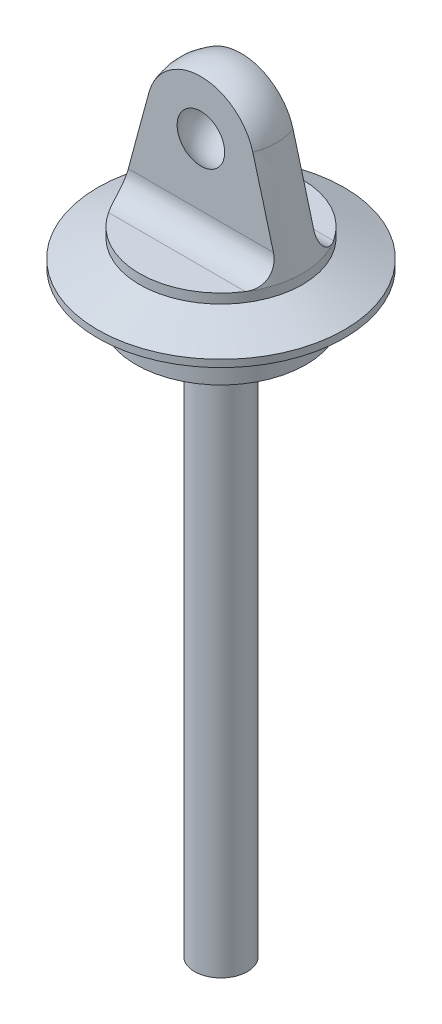
ISO-10303-21;
HEADER;
FILE_DESCRIPTION(('STEP AP214'),'2;1');
FILE_NAME('part.step','',(''),(''),'','','');
FILE_SCHEMA(('AUTOMOTIVE_DESIGN { 1 0 10303 214 1 1 1 1 }'));
ENDSEC;
DATA;
#1=APPLICATION_CONTEXT('core data for automotive mechanical design processes');
#2=APPLICATION_PROTOCOL_DEFINITION('international standard','automotive_design',2000,#1);
#3=PRODUCT_CONTEXT('',#1,'mechanical');
#4=PRODUCT('Part','Part','',(#3));
#5=PRODUCT_RELATED_PRODUCT_CATEGORY('part','',(#4));
#6=PRODUCT_DEFINITION_FORMATION('','',#4);
#7=PRODUCT_DEFINITION_CONTEXT('part definition',#1,'design');
#8=PRODUCT_DEFINITION('design','',#6,#7);
#9=PRODUCT_DEFINITION_SHAPE('','',#8);
#10=(LENGTH_UNIT() NAMED_UNIT(*) SI_UNIT(.MILLI.,.METRE.));
#11=(NAMED_UNIT(*) PLANE_ANGLE_UNIT() SI_UNIT($,.RADIAN.));
#12=(NAMED_UNIT(*) SI_UNIT($,.STERADIAN.) SOLID_ANGLE_UNIT());
#13=UNCERTAINTY_MEASURE_WITH_UNIT(LENGTH_MEASURE(1.E-05),#10,'distance_accuracy_value','');
#14=(GEOMETRIC_REPRESENTATION_CONTEXT(3) GLOBAL_UNCERTAINTY_ASSIGNED_CONTEXT((#13)) GLOBAL_UNIT_ASSIGNED_CONTEXT((#10,
#11,#12)) REPRESENTATION_CONTEXT('',''));
#15=CARTESIAN_POINT('',(0.,0.,0.));
#16=DIRECTION('',(0.,0.,1.));
#17=DIRECTION('',(1.,0.,0.));
#18=AXIS2_PLACEMENT_3D('',#15,#16,#17);
#19=CARTESIAN_POINT('',(-25.,12.4341797228698,4.2));
#20=DIRECTION('',(0.,0.,-1.));
#21=DIRECTION('',(0.,1.,0.));
#22=AXIS2_PLACEMENT_3D('',#19,#20,#21);
#23=PLANE('',#22);
#24=DIRECTION('',(1.,0.,0.));
#25=VECTOR('',#24,1.);
#26=CARTESIAN_POINT('',(-25.,-12.9999999999999,4.2));
#27=LINE('',#26,#25);
#28=CARTESIAN_POINT('',(-15.1473019204121,-12.9999999999999,4.2));
#29=VERTEX_POINT('',#28);
#30=CARTESIAN_POINT('',(15.1473019204121,-12.9999999999999,4.2));
#31=VERTEX_POINT('',#30);
#32=EDGE_CURVE('E210',#29,#31,#27,.T.);
#33=ORIENTED_EDGE('',*,*,#32,.T.);
#34=CARTESIAN_POINT('',(19.9716595180824,-31.3020394047828,4.19999999999999));
#35=CARTESIAN_POINT('',(19.4776075247665,-29.4153276961726,4.2));
#36=CARTESIAN_POINT('',(18.9828773920078,-27.5287930347851,4.2));
#37=CARTESIAN_POINT('',(17.9915745561946,-23.7562065797033,4.2));
#38=CARTESIAN_POINT('',(17.4950018518799,-21.8701547863403,4.2));
#39=CARTESIAN_POINT('',(16.4993380795889,-18.0979449120123,4.2));
#40=CARTESIAN_POINT('',(16.0002461218828,-16.2117870657761,4.2));
#41=CARTESIAN_POINT('',(14.9989904373376,-12.4402855042015,4.2));
#42=CARTESIAN_POINT('',(14.4968267093437,-10.5549417891696,4.2));
#43=CARTESIAN_POINT('',(13.4883488569719,-6.78540150514438,4.2));
#44=CARTESIAN_POINT('',(12.9820348096671,-4.90120491554345,4.2));
#45=CARTESIAN_POINT('',(11.9635907765257,-1.13438228532533,4.2));
#46=CARTESIAN_POINT('',(11.4514607957981,0.748243756669952,4.2));
#47=CARTESIAN_POINT('',(10.6768582303522,3.57015712641388,4.2));
#48=CARTESIAN_POINT('',(10.4176241359876,4.51033314652571,4.2));
#49=CARTESIAN_POINT('',(9.89644773535612,6.38993384256105,4.2));
#50=CARTESIAN_POINT('',(9.63450543192954,7.32935851927146,4.2));
#51=CARTESIAN_POINT('',(9.10719236497299,9.20726255133778,4.2));
#52=CARTESIAN_POINT('',(8.84182154696378,10.1457418914162,4.2));
#53=CARTESIAN_POINT('',(8.30663301694102,12.0214304039842,4.2));
#54=CARTESIAN_POINT('',(8.03681531694722,12.9586395798996,4.2));
#55=CARTESIAN_POINT('',(7.49117151080739,14.831627835311,4.2));
#56=CARTESIAN_POINT('',(7.21534357477504,15.767406383748,4.2));
#57=CARTESIAN_POINT('',(6.79540919775114,17.1691899211257,4.2));
#58=CARTESIAN_POINT('',(6.65440315943582,17.6361235802338,4.2));
#59=CARTESIAN_POINT('',(6.36989147373328,18.569233401789,4.2));
#60=CARTESIAN_POINT('',(6.22638580862238,19.0354095588393,4.2));
#61=CARTESIAN_POINT('',(5.9362912072578,19.9669624709196,4.2));
#62=CARTESIAN_POINT('',(5.78970132448228,20.4323389316989,4.2));
#63=CARTESIAN_POINT('',(5.49275249363868,21.3618795481232,4.2));
#64=CARTESIAN_POINT('',(5.34239362045278,21.8260437276518,4.2));
#65=CARTESIAN_POINT('',(5.03687249751781,22.752887983537,4.2));
#66=CARTESIAN_POINT('',(4.8817093890148,23.2155677780577,4.2));
#67=CARTESIAN_POINT('',(4.6442805632368,23.9079989437416,4.2));
#68=CARTESIAN_POINT('',(4.5643541448092,24.1385523493338,4.2));
#69=CARTESIAN_POINT('',(4.40267548000926,24.5990220929758,4.2));
#70=CARTESIAN_POINT('',(4.32092320252478,24.8289384200948,4.2));
#71=CARTESIAN_POINT('',(4.23812634470865,25.0584811329668,4.2));
#72=B_SPLINE_CURVE_WITH_KNOTS('',3,(#34,#35,#36,#37,#38,#39,#40,#41,#42,#43,#44,#45,#46,#47,#48,
#49,#50,#51,#52,#53,#54,#55,#56,#57,#58,#59,#60,#61,#62,#63,#64,#65,#66,#67,#68,#69,#70,#71),
.UNSPECIFIED.,.F.,.F.,(4,2,2,2,2,2,2,2,2,2,2,2,2,2,2,2,2,2,4),(0.,5.85097629425585,
11.701956591259,17.5551724464229,23.4083905021737,29.2615001066285,35.1146045697732,
38.0403833474501,40.966159056872,43.8919813143105,46.8177956646572,49.7445136164768,
51.2077879842033,52.6710727315455,54.1348132957826,55.5985248014843,57.0624994725429,
57.794536330646,58.5265856719871),.UNSPECIFIED.);
#73=CARTESIAN_POINT('',(10.8391741027136,2.978641430428,4.2));
#74=VERTEX_POINT('',#73);
#75=EDGE_CURVE('E115',#74,#31,#72,.F.);
#76=ORIENTED_EDGE('',*,*,#75,.F.);
#77=CARTESIAN_POINT('',(0.,0.,4.2));
#78=DIRECTION('',(0.,0.,-1.));
#79=DIRECTION('',(0.,1.,0.));
#80=AXIS2_PLACEMENT_3D('',#77,#78,#79);
#81=CIRCLE('',#80,11.2409963971171);
#82=CARTESIAN_POINT('',(-10.8391741027136,2.978641430428,4.2));
#83=VERTEX_POINT('',#82);
#84=EDGE_CURVE('E222',#83,#74,#81,.T.);
#85=ORIENTED_EDGE('',*,*,#84,.F.);
#86=CARTESIAN_POINT('',(-19.9716595180824,-31.3020394047828,4.19999999999999));
#87=CARTESIAN_POINT('',(-19.4776075247665,-29.4153276961726,4.2));
#88=CARTESIAN_POINT('',(-18.9828773920078,-27.5287930347851,4.2));
#89=CARTESIAN_POINT('',(-17.9915745561946,-23.7562065797033,4.2));
#90=CARTESIAN_POINT('',(-17.4950018518799,-21.8701547863403,4.2));
#91=CARTESIAN_POINT('',(-16.4993380795889,-18.0979449120123,4.2));
#92=CARTESIAN_POINT('',(-16.0002461218828,-16.2117870657761,4.2));
#93=CARTESIAN_POINT('',(-14.9989904373376,-12.4402855042015,4.2));
#94=CARTESIAN_POINT('',(-14.4968267093437,-10.5549417891696,4.2));
#95=CARTESIAN_POINT('',(-13.4883488569719,-6.78540150514439,4.2));
#96=CARTESIAN_POINT('',(-12.9820348096671,-4.90120491554345,4.2));
#97=CARTESIAN_POINT('',(-11.9635907765256,-1.13438228532533,4.2));
#98=CARTESIAN_POINT('',(-11.4514607957981,0.748243756669954,4.2));
#99=CARTESIAN_POINT('',(-10.6768582303522,3.57015712641389,4.2));
#100=CARTESIAN_POINT('',(-10.4176241359876,4.51033314652572,4.2));
#101=CARTESIAN_POINT('',(-9.89644773535612,6.38993384256106,4.2));
#102=CARTESIAN_POINT('',(-9.63450543192953,7.32935851927147,4.2));
#103=CARTESIAN_POINT('',(-9.10719236497299,9.20726255133779,4.2));
#104=CARTESIAN_POINT('',(-8.84182154696378,10.1457418914162,4.2));
#105=CARTESIAN_POINT('',(-8.30663301694102,12.0214304039842,4.2));
#106=CARTESIAN_POINT('',(-8.03681531694721,12.9586395798996,4.2));
#107=CARTESIAN_POINT('',(-7.49117151080739,14.831627835311,4.2));
#108=CARTESIAN_POINT('',(-7.21534357477504,15.767406383748,4.2));
#109=CARTESIAN_POINT('',(-6.79540919775114,17.1691899211257,4.2));
#110=CARTESIAN_POINT('',(-6.65440315943583,17.6361235802338,4.2));
#111=CARTESIAN_POINT('',(-6.36989147373329,18.569233401789,4.2));
#112=CARTESIAN_POINT('',(-6.22638580862238,19.0354095588393,4.2));
#113=CARTESIAN_POINT('',(-5.93629120725781,19.9669624709196,4.2));
#114=CARTESIAN_POINT('',(-5.78970132448228,20.4323389316989,4.2));
#115=CARTESIAN_POINT('',(-5.49275249363868,21.3618795481232,4.2));
#116=CARTESIAN_POINT('',(-5.34239362045278,21.8260437276518,4.2));
#117=CARTESIAN_POINT('',(-5.03687249751781,22.7528879835371,4.2));
#118=CARTESIAN_POINT('',(-4.8817093890148,23.2155677780577,4.2));
#119=CARTESIAN_POINT('',(-4.6442805632368,23.9079989437416,4.2));
#120=CARTESIAN_POINT('',(-4.5643541448092,24.1385523493338,4.2));
#121=CARTESIAN_POINT('',(-4.40267548000926,24.5990220929758,4.2));
#122=CARTESIAN_POINT('',(-4.32092320252478,24.8289384200948,4.2));
#123=CARTESIAN_POINT('',(-4.23812634470865,25.0584811329668,4.2));
#124=B_SPLINE_CURVE_WITH_KNOTS('',3,(#86,#87,#88,#89,#90,#91,#92,#93,#94,#95,#96,#97,#98,#99,
#100,#101,#102,#103,#104,#105,#106,#107,#108,#109,#110,#111,#112,#113,#114,#115,#116,#117,#118,
#119,#120,#121,#122,#123),.UNSPECIFIED.,.F.,.F.,(4,2,2,2,2,2,2,2,2,2,2,2,2,2,2,2,2,2,4),(0.,
5.85097629425585,11.701956591259,17.5551724464229,23.4083905021737,29.2615001066285,
35.1146045697732,38.0403833474501,40.9661590568721,43.8919813143105,46.8177956646573,
49.7445136164768,51.2077879842033,52.6710727315456,54.1348132957826,55.5985248014843,
57.0624994725429,57.7945363306461,58.5265856719871),.UNSPECIFIED.);
#125=EDGE_CURVE('E112',#29,#83,#124,.T.);
#126=ORIENTED_EDGE('',*,*,#125,.F.);
#127=EDGE_LOOP('',(#33,#76,#85,#126));
#128=FACE_BOUND('',#127,.T.);
#129=CARTESIAN_POINT('',(0.,0.,4.2));
#130=DIRECTION('',(0.,0.,-1.));
#131=DIRECTION('',(0.,1.,0.));
#132=AXIS2_PLACEMENT_3D('',#129,#130,#131);
#133=CIRCLE('',#132,4.96084670192499);
#134=CARTESIAN_POINT('',(0.,4.96084670192499,4.2));
#135=VERTEX_POINT('',#134);
#136=EDGE_CURVE('E104',#135,#135,#133,.F.);
#137=ORIENTED_EDGE('',*,*,#136,.F.);
#138=EDGE_LOOP('',(#137));
#139=FACE_BOUND('',#138,.T.);
#140=ADVANCED_FACE('F34',(#128,#139),#23,.F.);
#141=CARTESIAN_POINT('',(-25.,12.4341797228698,-4.2));
#142=DIRECTION('',(0.,0.,1.));
#143=DIRECTION('',(0.,-1.,0.));
#144=AXIS2_PLACEMENT_3D('',#141,#142,#143);
#145=PLANE('',#144);
#146=CARTESIAN_POINT('',(0.,0.,-4.2));
#147=DIRECTION('',(0.,0.,1.));
#148=DIRECTION('',(0.,-1.,0.));
#149=AXIS2_PLACEMENT_3D('',#146,#147,#148);
#150=CIRCLE('',#149,11.2409963971171);
#151=CARTESIAN_POINT('',(10.8391741027136,2.978641430428,-4.2));
#152=VERTEX_POINT('',#151);
#153=CARTESIAN_POINT('',(-10.8391741027136,2.978641430428,-4.2));
#154=VERTEX_POINT('',#153);
#155=EDGE_CURVE('E221',#152,#154,#150,.T.);
#156=ORIENTED_EDGE('',*,*,#155,.F.);
#157=CARTESIAN_POINT('',(19.9716595180824,-31.3020394047828,-4.19999999999999));
#158=CARTESIAN_POINT('',(19.4776075247665,-29.4153276961726,-4.19999999999999));
#159=CARTESIAN_POINT('',(18.9828773920078,-27.5287930347851,-4.2));
#160=CARTESIAN_POINT('',(17.9915745561946,-23.7562065797033,-4.2));
#161=CARTESIAN_POINT('',(17.4950018518799,-21.8701547863403,-4.2));
#162=CARTESIAN_POINT('',(16.4993380795889,-18.0979449120123,-4.2));
#163=CARTESIAN_POINT('',(16.0002461218828,-16.2117870657761,-4.2));
#164=CARTESIAN_POINT('',(14.9989904373376,-12.4402855042015,-4.2));
#165=CARTESIAN_POINT('',(14.4968267093437,-10.5549417891696,-4.2));
#166=CARTESIAN_POINT('',(13.4883488569719,-6.78540150514439,-4.2));
#167=CARTESIAN_POINT('',(12.9820348096671,-4.90120491554346,-4.2));
#168=CARTESIAN_POINT('',(11.9635907765256,-1.13438228532534,-4.2));
#169=CARTESIAN_POINT('',(11.4514607957981,0.748243756669947,-4.2));
#170=CARTESIAN_POINT('',(10.6768582303522,3.57015712641388,-4.2));
#171=CARTESIAN_POINT('',(10.4176241359876,4.51033314652571,-4.2));
#172=CARTESIAN_POINT('',(9.89644773535612,6.38993384256105,-4.2));
#173=CARTESIAN_POINT('',(9.63450543192954,7.32935851927146,-4.2));
#174=CARTESIAN_POINT('',(9.10719236497299,9.20726255133778,-4.2));
#175=CARTESIAN_POINT('',(8.84182154696378,10.1457418914162,-4.2));
#176=CARTESIAN_POINT('',(8.30663301694102,12.0214304039842,-4.2));
#177=CARTESIAN_POINT('',(8.03681531694722,12.9586395798996,-4.2));
#178=CARTESIAN_POINT('',(7.49117151080739,14.831627835311,-4.2));
#179=CARTESIAN_POINT('',(7.21534357477504,15.767406383748,-4.2));
#180=CARTESIAN_POINT('',(6.79540919775114,17.1691899211257,-4.2));
#181=CARTESIAN_POINT('',(6.65440315943582,17.6361235802338,-4.2));
#182=CARTESIAN_POINT('',(6.36989147373328,18.569233401789,-4.2));
#183=CARTESIAN_POINT('',(6.22638580862238,19.0354095588393,-4.2));
#184=CARTESIAN_POINT('',(5.9362912072578,19.9669624709196,-4.2));
#185=CARTESIAN_POINT('',(5.78970132448228,20.4323389316989,-4.2));
#186=CARTESIAN_POINT('',(5.49275249363868,21.3618795481232,-4.2));
#187=CARTESIAN_POINT('',(5.34239362045277,21.8260437276518,-4.2));
#188=CARTESIAN_POINT('',(5.0368724975178,22.7528879835371,-4.2));
#189=CARTESIAN_POINT('',(4.8817093890148,23.2155677780577,-4.2));
#190=CARTESIAN_POINT('',(4.6442805632368,23.9079989437416,-4.2));
#191=CARTESIAN_POINT('',(4.5643541448092,24.1385523493338,-4.2));
#192=CARTESIAN_POINT('',(4.40267548000926,24.5990220929758,-4.2));
#193=CARTESIAN_POINT('',(4.32092320252478,24.8289384200948,-4.2));
#194=CARTESIAN_POINT('',(4.23812634470865,25.0584811329668,-4.2));
#195=B_SPLINE_CURVE_WITH_KNOTS('',3,(#157,#158,#159,#160,#161,#162,#163,#164,#165,#166,#167,
#168,#169,#170,#171,#172,#173,#174,#175,#176,#177,#178,#179,#180,#181,#182,#183,#184,#185,#186,
#187,#188,#189,#190,#191,#192,#193,#194),.UNSPECIFIED.,.F.,.F.,(4,2,2,2,2,2,2,2,2,2,2,2,2,2,2,2,
2,2,4),(0.,5.85097629425585,11.701956591259,17.5551724464229,23.4083905021737,29.2615001066285,
35.1146045697732,38.0403833474501,40.966159056872,43.8919813143105,46.8177956646572,
49.7445136164768,51.2077879842033,52.6710727315456,54.1348132957826,55.5985248014843,
57.0624994725429,57.794536330646,58.5265856719871),.UNSPECIFIED.);
#196=CARTESIAN_POINT('',(15.1473019204121,-12.9999999999999,-4.2));
#197=VERTEX_POINT('',#196);
#198=EDGE_CURVE('E43',#197,#152,#195,.T.);
#199=ORIENTED_EDGE('',*,*,#198,.F.);
#200=DIRECTION('',(1.,0.,0.));
#201=VECTOR('',#200,1.);
#202=CARTESIAN_POINT('',(-25.,-12.9999999999999,-4.2));
#203=LINE('',#202,#201);
#204=CARTESIAN_POINT('',(-15.1473019204121,-12.9999999999999,-4.2));
#205=VERTEX_POINT('',#204);
#206=EDGE_CURVE('E92',#205,#197,#203,.T.);
#207=ORIENTED_EDGE('',*,*,#206,.F.);
#208=CARTESIAN_POINT('',(-19.9716595180824,-31.3020394047828,-4.19999999999999));
#209=CARTESIAN_POINT('',(-19.4776075247665,-29.4153276961726,-4.19999999999999));
#210=CARTESIAN_POINT('',(-18.9828773920078,-27.5287930347851,-4.2));
#211=CARTESIAN_POINT('',(-17.9915745561946,-23.7562065797033,-4.2));
#212=CARTESIAN_POINT('',(-17.4950018518799,-21.8701547863403,-4.2));
#213=CARTESIAN_POINT('',(-16.4993380795889,-18.0979449120123,-4.2));
#214=CARTESIAN_POINT('',(-16.0002461218828,-16.2117870657761,-4.2));
#215=CARTESIAN_POINT('',(-14.9989904373376,-12.4402855042015,-4.2));
#216=CARTESIAN_POINT('',(-14.4968267093437,-10.5549417891696,-4.2));
#217=CARTESIAN_POINT('',(-13.4883488569719,-6.78540150514439,-4.2));
#218=CARTESIAN_POINT('',(-12.9820348096671,-4.90120491554346,-4.2));
#219=CARTESIAN_POINT('',(-11.9635907765256,-1.13438228532534,-4.2));
#220=CARTESIAN_POINT('',(-11.4514607957981,0.748243756669943,-4.2));
#221=CARTESIAN_POINT('',(-10.6768582303522,3.57015712641387,-4.2));
#222=CARTESIAN_POINT('',(-10.4176241359876,4.5103331465257,-4.2));
#223=CARTESIAN_POINT('',(-9.89644773535612,6.38993384256105,-4.2));
#224=CARTESIAN_POINT('',(-9.63450543192954,7.32935851927146,-4.2));
#225=CARTESIAN_POINT('',(-9.10719236497299,9.20726255133778,-4.2));
#226=CARTESIAN_POINT('',(-8.84182154696378,10.1457418914162,-4.2));
#227=CARTESIAN_POINT('',(-8.30663301694102,12.0214304039842,-4.2));
#228=CARTESIAN_POINT('',(-8.03681531694721,12.9586395798996,-4.2));
#229=CARTESIAN_POINT('',(-7.49117151080739,14.831627835311,-4.2));
#230=CARTESIAN_POINT('',(-7.21534357477504,15.767406383748,-4.2));
#231=CARTESIAN_POINT('',(-6.79540919775114,17.1691899211257,-4.2));
#232=CARTESIAN_POINT('',(-6.65440315943582,17.6361235802338,-4.2));
#233=CARTESIAN_POINT('',(-6.36989147373328,18.569233401789,-4.2));
#234=CARTESIAN_POINT('',(-6.22638580862238,19.0354095588393,-4.2));
#235=CARTESIAN_POINT('',(-5.9362912072578,19.9669624709196,-4.2));
#236=CARTESIAN_POINT('',(-5.78970132448228,20.4323389316989,-4.2));
#237=CARTESIAN_POINT('',(-5.49275249363868,21.3618795481232,-4.2));
#238=CARTESIAN_POINT('',(-5.34239362045277,21.8260437276518,-4.2));
#239=CARTESIAN_POINT('',(-5.03687249751781,22.7528879835371,-4.2));
#240=CARTESIAN_POINT('',(-4.8817093890148,23.2155677780577,-4.2));
#241=CARTESIAN_POINT('',(-4.6442805632368,23.9079989437416,-4.2));
#242=CARTESIAN_POINT('',(-4.5643541448092,24.1385523493338,-4.2));
#243=CARTESIAN_POINT('',(-4.40267548000926,24.5990220929758,-4.2));
#244=CARTESIAN_POINT('',(-4.32092320252478,24.8289384200948,-4.2));
#245=CARTESIAN_POINT('',(-4.23812634470865,25.0584811329668,-4.2));
#246=B_SPLINE_CURVE_WITH_KNOTS('',3,(#208,#209,#210,#211,#212,#213,#214,#215,#216,#217,#218,
#219,#220,#221,#222,#223,#224,#225,#226,#227,#228,#229,#230,#231,#232,#233,#234,#235,#236,#237,
#238,#239,#240,#241,#242,#243,#244,#245),.UNSPECIFIED.,.F.,.F.,(4,2,2,2,2,2,2,2,2,2,2,2,2,2,2,2,
2,2,4),(0.,5.85097629425585,11.701956591259,17.5551724464229,23.4083905021737,29.2615001066285,
35.1146045697732,38.0403833474501,40.966159056872,43.8919813143105,46.8177956646572,
49.7445136164768,51.2077879842033,52.6710727315456,54.1348132957826,55.5985248014843,
57.0624994725429,57.794536330646,58.5265856719871),.UNSPECIFIED.);
#247=EDGE_CURVE('E11',#154,#205,#246,.F.);
#248=ORIENTED_EDGE('',*,*,#247,.F.);
#249=EDGE_LOOP('',(#156,#199,#207,#248));
#250=FACE_BOUND('',#249,.T.);
#251=CARTESIAN_POINT('',(0.,0.,-4.2));
#252=DIRECTION('',(0.,0.,1.));
#253=DIRECTION('',(0.,-1.,0.));
#254=AXIS2_PLACEMENT_3D('',#251,#252,#253);
#255=CIRCLE('',#254,4.96084670192499);
#256=CARTESIAN_POINT('',(0.,-4.96084670192499,-4.2));
#257=VERTEX_POINT('',#256);
#258=EDGE_CURVE('E38',#257,#257,#255,.F.);
#259=ORIENTED_EDGE('',*,*,#258,.F.);
#260=EDGE_LOOP('',(#259));
#261=FACE_BOUND('',#260,.T.);
#262=ADVANCED_FACE('F100',(#250,#261),#145,.F.);
#263=CARTESIAN_POINT('',(0.,2.978641430428,0.));
#264=DIRECTION('',(0.,-1.,0.));
#265=DIRECTION('',(1.,0.,0.));
#266=AXIS2_PLACEMENT_3D('',#263,#264,#265);
#267=CONICAL_SURFACE('',#266,11.624443867512,0.250842437167083);
#268=ORIENTED_EDGE('',*,*,#247,.T.);
#269=CARTESIAN_POINT('',(-15.1472487378414,-12.9998,-4.200000004));
#270=CARTESIAN_POINT('',(-15.1824089998724,-13.1320573724466,-4.19998210280909));
#271=CARTESIAN_POINT('',(-15.2162230498622,-13.2646878828116,-4.20523679197878));
#272=CARTESIAN_POINT('',(-15.2808831510092,-13.5298668034986,-4.2263790444602));
#273=CARTESIAN_POINT('',(-15.3117282694598,-13.6624151751069,-4.24226993680509));
#274=CARTESIAN_POINT('',(-15.3702410849759,-13.9269177177806,-4.28483681107904));
#275=CARTESIAN_POINT('',(-15.3978988692413,-14.058868870663,-4.31154533237789));
#276=CARTESIAN_POINT('',(-15.4495624141345,-14.3208440722602,-4.37573278804112));
#277=CARTESIAN_POINT('',(-15.4735685370769,-14.450868311005,-4.41321065281313));
#278=CARTESIAN_POINT('',(-15.5175717380589,-14.7083780997107,-4.49894648258339));
#279=CARTESIAN_POINT('',(-15.5375589054949,-14.8358566922231,-4.54723049094201));
#280=CARTESIAN_POINT('',(-15.5729848258751,-15.0869692893901,-4.65432201406401));
#281=CARTESIAN_POINT('',(-15.588423790531,-15.2106034727564,-4.71312903879224));
#282=CARTESIAN_POINT('',(-15.6142381966481,-15.4528704512047,-4.84085428706026));
#283=CARTESIAN_POINT('',(-15.6246206888072,-15.5715099985126,-4.90975825598178));
#284=CARTESIAN_POINT('',(-15.6398432445696,-15.8029686295869,-5.05727195415929));
#285=CARTESIAN_POINT('',(-15.6446837199183,-15.915788145159,-5.13588096189627));
#286=CARTESIAN_POINT('',(-15.648224169503,-16.1285421060182,-5.29755579174903));
#287=CARTESIAN_POINT('',(-15.6472505485365,-16.2288441928376,-5.38013090851137));
#288=CARTESIAN_POINT('',(-15.639532320623,-16.4225926454685,-5.55271514995878));
#289=CARTESIAN_POINT('',(-15.632788158913,-16.5160395396016,-5.64272370061898));
#290=CARTESIAN_POINT('',(-15.6132051563694,-16.695345523988,-5.82936712958837));
#291=CARTESIAN_POINT('',(-15.6003672006406,-16.7812057140391,-5.9260010438406));
#292=CARTESIAN_POINT('',(-15.5683554648332,-16.9447258439417,-6.12498473648627));
#293=CARTESIAN_POINT('',(-15.5491819856836,-17.0223861730445,-6.22733424320486));
#294=CARTESIAN_POINT('',(-15.5058295709231,-17.1642182564972,-6.42988095722289));
#295=CARTESIAN_POINT('',(-15.4820597082616,-17.2289398684374,-6.52978159612866));
#296=CARTESIAN_POINT('',(-15.4288395164406,-17.3505319366198,-6.73283934948654));
#297=CARTESIAN_POINT('',(-15.3993873416679,-17.4073998316521,-6.8359975128523));
#298=CARTESIAN_POINT('',(-15.3348822850366,-17.5130922117139,-7.04461959590464));
#299=CARTESIAN_POINT('',(-15.2998308666234,-17.5619187917064,-7.15008290690674));
#300=CARTESIAN_POINT('',(-15.2242790063463,-17.6515394808055,-7.36247748899681));
#301=CARTESIAN_POINT('',(-15.183776607742,-17.692330692438,-7.46940927478862));
#302=CARTESIAN_POINT('',(-15.0528158825588,-17.8041076806099,-7.79509022131879));
#303=CARTESIAN_POINT('',(-14.9540697275105,-17.8626012591666,-8.0149274249716));
#304=CARTESIAN_POINT('',(-14.7374888252965,-17.9485641094799,-8.45089729121348));
#305=CARTESIAN_POINT('',(-14.619662824693,-17.9760475510891,-8.6670316013131));
#306=CARTESIAN_POINT('',(-14.4617806903016,-17.9931699909637,-8.9331625253473));
#307=CARTESIAN_POINT('',(-14.4291499343141,-17.9957501302703,-8.98702350339916));
#308=CARTESIAN_POINT('',(-14.3629470525856,-17.9991640336216,-9.09408641296631));
#309=CARTESIAN_POINT('',(-14.3293767216956,-18.000000924023,-9.147289353909));
#310=CARTESIAN_POINT('',(-14.2953251073612,-17.999999996,-9.20019999999999));
#311=B_SPLINE_CURVE_WITH_KNOTS('',3,(#269,#270,#271,#272,#273,#274,#275,#276,#277,#278,#279,
#280,#281,#282,#283,#284,#285,#286,#287,#288,#289,#290,#291,#292,#293,#294,#295,#296,#297,#298,
#299,#300,#301,#302,#303,#304,#305,#306,#307,#308,#309,#310),.UNSPECIFIED.,.F.,.F.,(4,2,2,2,2,2,
2,2,2,2,2,2,2,2,2,2,2,2,2,2,4),(0.,0.410466959595392,0.82106245166387,1.23290229549753,
1.64470125024701,2.05750355838471,2.4702866481714,2.88249249728922,3.29466771948565,
3.68392919329096,4.07316063559179,4.46233556052006,4.851492002816,5.21521273648539,
5.57905180602005,5.94279593593916,6.30667098924913,7.04747185018897,7.7879340704005,
7.97699772321015,8.16572201477354),.UNSPECIFIED.);
#312=CARTESIAN_POINT('',(-14.2954538228067,-18.,-9.20000000000003));
#313=VERTEX_POINT('',#312);
#314=EDGE_CURVE('E89',#205,#313,#311,.T.);
#315=ORIENTED_EDGE('',*,*,#314,.T.);
#316=CARTESIAN_POINT('',(0.,-18.,0.));
#317=DIRECTION('',(0.,-1.,0.));
#318=DIRECTION('',(1.,0.,0.));
#319=AXIS2_PLACEMENT_3D('',#316,#317,#318);
#320=CIRCLE('',#319,17.);
#321=CARTESIAN_POINT('',(-14.2954538228067,-18.,9.20000000000003));
#322=VERTEX_POINT('',#321);
#323=EDGE_CURVE('E250',#322,#313,#320,.T.);
#324=ORIENTED_EDGE('',*,*,#323,.F.);
#325=CARTESIAN_POINT('',(-14.2953251073612,-17.999999996,9.20019999999999));
#326=CARTESIAN_POINT('',(-14.3704859365652,-18.0000108235311,9.08344293105017));
#327=CARTESIAN_POINT('',(-14.4433380368837,-17.9959190046004,8.96514136607075));
#328=CARTESIAN_POINT('',(-14.5839607157803,-17.9789277541317,8.72603415282719));
#329=CARTESIAN_POINT('',(-14.6517265054235,-17.966020134868,8.6052262780366));
#330=CARTESIAN_POINT('',(-14.7819233912282,-17.9306970422867,8.36125024779791));
#331=CARTESIAN_POINT('',(-14.844323508582,-17.9082303012945,8.23807283572847));
#332=CARTESIAN_POINT('',(-14.9628327098609,-17.8532706230297,7.99095970503921));
#333=CARTESIAN_POINT('',(-15.0189435932571,-17.8207805636564,7.86702421407803));
#334=CARTESIAN_POINT('',(-15.1247404334554,-17.7451443076601,7.61868651881164));
#335=CARTESIAN_POINT('',(-15.17438540983,-17.7019347499834,7.49428603536336));
#336=CARTESIAN_POINT('',(-15.2664463130146,-17.604732603498,7.24703349572783));
#337=CARTESIAN_POINT('',(-15.3088630086035,-17.5507411627473,7.12418127616041));
#338=CARTESIAN_POINT('',(-15.3860874060308,-17.4321221379096,6.88171277649521));
#339=CARTESIAN_POINT('',(-15.4209165516303,-17.3675254578968,6.76208823652471));
#340=CARTESIAN_POINT('',(-15.482990722223,-17.2278018568443,6.52710474752362));
#341=CARTESIAN_POINT('',(-15.510236757541,-17.1526763406064,6.41174523202631));
#342=CARTESIAN_POINT('',(-15.5546424978072,-17.0010286180855,6.19884048720566));
#343=CARTESIAN_POINT('',(-15.5725749109088,-16.9255384928066,6.10071888010853));
#344=CARTESIAN_POINT('',(-15.6025822392786,-16.7669642391214,5.90980526350555));
#345=CARTESIAN_POINT('',(-15.6146552668568,-16.6838776736377,5.81701498004325));
#346=CARTESIAN_POINT('',(-15.6331561749183,-16.5106744353181,5.63759662525656));
#347=CARTESIAN_POINT('',(-15.6395825226803,-16.4205558609535,5.55097023290445));
#348=CARTESIAN_POINT('',(-15.6470786926476,-16.2339225968537,5.3845862875992));
#349=CARTESIAN_POINT('',(-15.6481464845354,-16.1374054967959,5.30483134943657));
#350=CARTESIAN_POINT('',(-15.6453095665985,-15.9419170637392,5.15527860895234));
#351=CARTESIAN_POINT('',(-15.6415643785184,-15.8431257402426,5.08524237520008));
#352=CARTESIAN_POINT('',(-15.6297145511247,-15.6409009731795,4.95261369971758));
#353=CARTESIAN_POINT('',(-15.6216083670274,-15.5374658965759,4.89002390531903));
#354=CARTESIAN_POINT('',(-15.5912645757301,-15.2212339466546,4.71400064904609));
#355=CARTESIAN_POINT('',(-15.5629988127717,-15.0023731317549,4.6122086703995));
#356=CARTESIAN_POINT('',(-15.491049746087,-14.5409816590741,4.43659588968452));
#357=CARTESIAN_POINT('',(-15.4465470853564,-14.2978178843282,4.36480666838281));
#358=CARTESIAN_POINT('',(-15.3453277858684,-13.8060891686594,4.2590194656249));
#359=CARTESIAN_POINT('',(-15.2886263367909,-13.5575312873408,4.22497480690609));
#360=CARTESIAN_POINT('',(-15.2140612793985,-13.2577318571009,4.20637679056185));
#361=CARTESIAN_POINT('',(-15.2009871580435,-13.2060589143271,4.20397977293343));
#362=CARTESIAN_POINT('',(-15.1744281663836,-13.1028437067921,4.20079240576625));
#363=CARTESIAN_POINT('',(-15.1609438767621,-13.0513013598375,4.19999988318417));
#364=CARTESIAN_POINT('',(-15.1472487378414,-12.9998,4.20000000399994));
#365=B_SPLINE_CURVE_WITH_KNOTS('',3,(#325,#326,#327,#328,#329,#330,#331,#332,#333,#334,#335,
#336,#337,#338,#339,#340,#341,#342,#343,#344,#345,#346,#347,#348,#349,#350,#351,#352,#353,#354,
#355,#356,#357,#358,#359,#360,#361,#362,#363,#364),.UNSPECIFIED.,.F.,.F.,(4,2,2,2,2,2,2,2,2,2,2,
2,2,2,2,2,2,2,2,4),(0.,0.416556987478156,0.833501381714651,1.25271070120636,1.67179976898549,
2.09342761866985,2.51501059722295,2.93538618927629,3.35570574635219,3.73051229514083,
4.10543951353193,4.48046846986011,4.85563951117885,5.21869069499123,5.5818705662023,
6.30771844792734,7.07687965230457,7.84508859963175,8.00514321177683,8.16498090900823),.UNSPECIFIED.);
#366=EDGE_CURVE('E156',#322,#29,#365,.T.);
#367=ORIENTED_EDGE('',*,*,#366,.T.);
#368=ORIENTED_EDGE('',*,*,#125,.T.);
#369=CARTESIAN_POINT('',(0.,2.978641430428,0.));
#370=DIRECTION('',(0.,-1.,0.));
#371=DIRECTION('',(1.,0.,0.));
#372=AXIS2_PLACEMENT_3D('',#369,#370,#371);
#373=CIRCLE('',#372,11.624443867512);
#374=EDGE_CURVE('E110',#83,#154,#373,.T.);
#375=ORIENTED_EDGE('',*,*,#374,.T.);
#376=EDGE_LOOP('',(#268,#315,#324,#367,#368,#375));
#377=FACE_BOUND('',#376,.T.);
#378=ADVANCED_FACE('F107',(#377),#267,.T.);
#379=CARTESIAN_POINT('',(0.,0.,0.));
#380=DIRECTION('',(0.,-1.,0.));
#381=DIRECTION('',(1.,0.,0.));
#382=AXIS2_PLACEMENT_3D('',#379,#380,#381);
#383=SPHERICAL_SURFACE('',#382,12.);
#384=EDGE_CURVE('E116',#152,#74,#373,.T.);
#385=ORIENTED_EDGE('',*,*,#384,.F.);
#386=ORIENTED_EDGE('',*,*,#155,.T.);
#387=ORIENTED_EDGE('',*,*,#374,.F.);
#388=ORIENTED_EDGE('',*,*,#84,.T.);
#389=EDGE_LOOP('',(#385,#386,#387,#388));
#390=FACE_BOUND('',#389,.T.);
#391=ADVANCED_FACE('F36',(#390),#383,.T.);
#392=CARTESIAN_POINT('',(14.2954538228068,-18.,-9.2));
#393=VERTEX_POINT('',#392);
#394=CARTESIAN_POINT('',(14.2954538228067,-18.,9.20000000000003));
#395=VERTEX_POINT('',#394);
#396=EDGE_CURVE('E243',#393,#395,#320,.T.);
#397=ORIENTED_EDGE('',*,*,#396,.F.);
#398=CARTESIAN_POINT('',(14.2953251073612,-17.999999996,-9.20019999999999));
#399=CARTESIAN_POINT('',(14.3704859365652,-18.0000108235311,-9.08344293105017));
#400=CARTESIAN_POINT('',(14.4433380368837,-17.9959190046004,-8.96514136607075));
#401=CARTESIAN_POINT('',(14.5839607157803,-17.9789277541317,-8.72603415282719));
#402=CARTESIAN_POINT('',(14.6517265054235,-17.966020134868,-8.6052262780366));
#403=CARTESIAN_POINT('',(14.7819233912282,-17.9306970422867,-8.36125024779791));
#404=CARTESIAN_POINT('',(14.844323508582,-17.9082303012945,-8.23807283572847));
#405=CARTESIAN_POINT('',(14.9628327098609,-17.8532706230297,-7.99095970503921));
#406=CARTESIAN_POINT('',(15.0189435932571,-17.8207805636564,-7.86702421407803));
#407=CARTESIAN_POINT('',(15.1247404334554,-17.7451443076601,-7.61868651881164));
#408=CARTESIAN_POINT('',(15.17438540983,-17.7019347499834,-7.49428603536336));
#409=CARTESIAN_POINT('',(15.2664463130146,-17.604732603498,-7.24703349572783));
#410=CARTESIAN_POINT('',(15.3088630086035,-17.5507411627473,-7.12418127616041));
#411=CARTESIAN_POINT('',(15.3860874060308,-17.4321221379096,-6.88171277649521));
#412=CARTESIAN_POINT('',(15.4209165516303,-17.3675254578968,-6.76208823652471));
#413=CARTESIAN_POINT('',(15.482990722223,-17.2278018568443,-6.52710474752362));
#414=CARTESIAN_POINT('',(15.510236757541,-17.1526763406064,-6.4117452320263));
#415=CARTESIAN_POINT('',(15.5546424978072,-17.0010286180855,-6.19884048720566));
#416=CARTESIAN_POINT('',(15.5725749109088,-16.9255384928066,-6.10071888010852));
#417=CARTESIAN_POINT('',(15.6025822392786,-16.7669642391214,-5.90980526350554));
#418=CARTESIAN_POINT('',(15.6146552668568,-16.6838776736377,-5.81701498004325));
#419=CARTESIAN_POINT('',(15.6331561749183,-16.5106744353181,-5.63759662525655));
#420=CARTESIAN_POINT('',(15.6395825226803,-16.4205558609535,-5.55097023290444));
#421=CARTESIAN_POINT('',(15.6470786926476,-16.2339225968537,-5.38458628759919));
#422=CARTESIAN_POINT('',(15.6481464845354,-16.1374054967959,-5.30483134943657));
#423=CARTESIAN_POINT('',(15.6453095665985,-15.9419170637392,-5.15527860895234));
#424=CARTESIAN_POINT('',(15.6415643785184,-15.8431257402426,-5.08524237520008));
#425=CARTESIAN_POINT('',(15.6297145511248,-15.6409009731795,-4.95261369971758));
#426=CARTESIAN_POINT('',(15.6216083670274,-15.5374658965759,-4.89002390531903));
#427=CARTESIAN_POINT('',(15.5912645757301,-15.2212339466546,-4.71400064904609));
#428=CARTESIAN_POINT('',(15.5629988127717,-15.0023731317549,-4.61220867039949));
#429=CARTESIAN_POINT('',(15.491049746087,-14.5409816590741,-4.43659588968452));
#430=CARTESIAN_POINT('',(15.4465470853564,-14.2978178843282,-4.36480666838281));
#431=CARTESIAN_POINT('',(15.3453277858684,-13.8060891686594,-4.2590194656249));
#432=CARTESIAN_POINT('',(15.2886263367909,-13.5575312873408,-4.22497480690609));
#433=CARTESIAN_POINT('',(15.2140612793985,-13.2577318571009,-4.20637679056185));
#434=CARTESIAN_POINT('',(15.2009871580435,-13.2060589143271,-4.20397977293343));
#435=CARTESIAN_POINT('',(15.1744281663836,-13.1028437067921,-4.20079240576625));
#436=CARTESIAN_POINT('',(15.1609438767621,-13.0513013598375,-4.19999988318417));
#437=CARTESIAN_POINT('',(15.1472487378414,-12.9998,-4.20000000399994));
#438=B_SPLINE_CURVE_WITH_KNOTS('',3,(#398,#399,#400,#401,#402,#403,#404,#405,#406,#407,#408,
#409,#410,#411,#412,#413,#414,#415,#416,#417,#418,#419,#420,#421,#422,#423,#424,#425,#426,#427,
#428,#429,#430,#431,#432,#433,#434,#435,#436,#437),.UNSPECIFIED.,.F.,.F.,(4,2,2,2,2,2,2,2,2,2,2,
2,2,2,2,2,2,2,2,4),(0.,0.416556987478156,0.833501381714651,1.25271070120636,1.6717997689855,
2.09342761866985,2.51501059722295,2.9353861892763,3.3557057463522,3.73051229514083,
4.10543951353194,4.48046846986012,4.85563951117886,5.21869069499123,5.5818705662023,
6.30771844792735,7.07687965230458,7.84508859963175,8.00514321177683,8.16498090900823),.UNSPECIFIED.);
#439=EDGE_CURVE('E97',#393,#197,#438,.T.);
#440=ORIENTED_EDGE('',*,*,#439,.T.);
#441=ORIENTED_EDGE('',*,*,#198,.T.);
#442=ORIENTED_EDGE('',*,*,#384,.T.);
#443=ORIENTED_EDGE('',*,*,#75,.T.);
#444=CARTESIAN_POINT('',(15.1472487378414,-12.9998,4.200000004));
#445=CARTESIAN_POINT('',(15.1824089998724,-13.1320573724466,4.19998210280909));
#446=CARTESIAN_POINT('',(15.2162230498623,-13.2646878828116,4.20523679197878));
#447=CARTESIAN_POINT('',(15.2808831510092,-13.5298668034986,4.2263790444602));
#448=CARTESIAN_POINT('',(15.3117282694598,-13.6624151751069,4.24226993680509));
#449=CARTESIAN_POINT('',(15.3702410849759,-13.9269177177806,4.28483681107904));
#450=CARTESIAN_POINT('',(15.3978988692413,-14.058868870663,4.31154533237789));
#451=CARTESIAN_POINT('',(15.4495624141345,-14.3208440722602,4.37573278804112));
#452=CARTESIAN_POINT('',(15.4735685370769,-14.450868311005,4.41321065281313));
#453=CARTESIAN_POINT('',(15.5175717380589,-14.7083780997107,4.49894648258339));
#454=CARTESIAN_POINT('',(15.5375589054949,-14.8358566922231,4.54723049094201));
#455=CARTESIAN_POINT('',(15.5729848258751,-15.0869692893901,4.65432201406401));
#456=CARTESIAN_POINT('',(15.588423790531,-15.2106034727564,4.71312903879224));
#457=CARTESIAN_POINT('',(15.6142381966481,-15.4528704512047,4.84085428706026));
#458=CARTESIAN_POINT('',(15.6246206888072,-15.5715099985126,4.90975825598178));
#459=CARTESIAN_POINT('',(15.6398432445696,-15.8029686295869,5.05727195415929));
#460=CARTESIAN_POINT('',(15.6446837199183,-15.915788145159,5.13588096189627));
#461=CARTESIAN_POINT('',(15.648224169503,-16.1285421060182,5.29755579174903));
#462=CARTESIAN_POINT('',(15.6472505485365,-16.2288441928376,5.38013090851137));
#463=CARTESIAN_POINT('',(15.639532320623,-16.4225926454685,5.55271514995878));
#464=CARTESIAN_POINT('',(15.6327881589131,-16.5160395396016,5.64272370061898));
#465=CARTESIAN_POINT('',(15.6132051563695,-16.695345523988,5.82936712958837));
#466=CARTESIAN_POINT('',(15.6003672006406,-16.7812057140391,5.9260010438406));
#467=CARTESIAN_POINT('',(15.5683554648332,-16.9447258439417,6.12498473648627));
#468=CARTESIAN_POINT('',(15.5491819856836,-17.0223861730445,6.22733424320487));
#469=CARTESIAN_POINT('',(15.5058295709231,-17.1642182564972,6.42988095722289));
#470=CARTESIAN_POINT('',(15.4820597082616,-17.2289398684374,6.52978159612866));
#471=CARTESIAN_POINT('',(15.4288395164406,-17.3505319366198,6.73283934948655));
#472=CARTESIAN_POINT('',(15.3993873416679,-17.4073998316521,6.8359975128523));
#473=CARTESIAN_POINT('',(15.3348822850367,-17.5130922117139,7.04461959590465));
#474=CARTESIAN_POINT('',(15.2998308666234,-17.5619187917064,7.15008290690674));
#475=CARTESIAN_POINT('',(15.2242790063463,-17.6515394808055,7.36247748899681));
#476=CARTESIAN_POINT('',(15.183776607742,-17.692330692438,7.46940927478862));
#477=CARTESIAN_POINT('',(15.0528158825588,-17.8041076806099,7.79509022131879));
#478=CARTESIAN_POINT('',(14.9540697275105,-17.8626012591666,8.0149274249716));
#479=CARTESIAN_POINT('',(14.7374888252965,-17.9485641094799,8.45089729121348));
#480=CARTESIAN_POINT('',(14.619662824693,-17.9760475510891,8.6670316013131));
#481=CARTESIAN_POINT('',(14.4617806903016,-17.9931699909637,8.9331625253473));
#482=CARTESIAN_POINT('',(14.4291499343141,-17.9957501302703,8.98702350339916));
#483=CARTESIAN_POINT('',(14.3629470525856,-17.9991640336216,9.09408641296631));
#484=CARTESIAN_POINT('',(14.3293767216956,-18.000000924023,9.147289353909));
#485=CARTESIAN_POINT('',(14.2953251073612,-17.999999996,9.20019999999999));
#486=B_SPLINE_CURVE_WITH_KNOTS('',3,(#444,#445,#446,#447,#448,#449,#450,#451,#452,#453,#454,
#455,#456,#457,#458,#459,#460,#461,#462,#463,#464,#465,#466,#467,#468,#469,#470,#471,#472,#473,
#474,#475,#476,#477,#478,#479,#480,#481,#482,#483,#484,#485),.UNSPECIFIED.,.F.,.F.,(4,2,2,2,2,2,
2,2,2,2,2,2,2,2,2,2,2,2,2,2,4),(0.,0.410466959595392,0.82106245166387,1.23290229549753,
1.64470125024701,2.05750355838471,2.4702866481714,2.88249249728922,3.29466771948566,
3.68392919329096,4.07316063559179,4.46233556052006,4.851492002816,5.21521273648539,
5.57905180602006,5.94279593593916,6.30667098924913,7.04747185018897,7.7879340704005,
7.97699772321015,8.16572201477353),.UNSPECIFIED.);
#487=EDGE_CURVE('E147',#31,#395,#486,.T.);
#488=ORIENTED_EDGE('',*,*,#487,.T.);
#489=EDGE_LOOP('',(#397,#440,#441,#442,#443,#488));
#490=FACE_BOUND('',#489,.T.);
#491=ADVANCED_FACE('F137',(#490),#267,.T.);
#492=CARTESIAN_POINT('',(0.,-150.,0.));
#493=DIRECTION('',(0.,-1.,0.));
#494=DIRECTION('',(1.,0.,0.));
#495=AXIS2_PLACEMENT_3D('',#492,#493,#494);
#496=CYLINDRICAL_SURFACE('',#495,17.);
#497=CARTESIAN_POINT('',(0.,-20.,0.));
#498=DIRECTION('',(0.,-1.,0.));
#499=DIRECTION('',(1.,0.,0.));
#500=AXIS2_PLACEMENT_3D('',#497,#498,#499);
#501=CIRCLE('',#500,17.);
#502=CARTESIAN_POINT('',(17.,-20.,0.));
#503=VERTEX_POINT('',#502);
#504=EDGE_CURVE('E241',#503,#503,#501,.T.);
#505=ORIENTED_EDGE('',*,*,#504,.F.);
#506=EDGE_LOOP('',(#505));
#507=FACE_BOUND('',#506,.T.);
#508=EDGE_CURVE('E120',#395,#322,#320,.T.);
#509=ORIENTED_EDGE('',*,*,#508,.T.);
#510=ORIENTED_EDGE('',*,*,#323,.T.);
#511=EDGE_CURVE('E246',#313,#393,#320,.T.);
#512=ORIENTED_EDGE('',*,*,#511,.T.);
#513=ORIENTED_EDGE('',*,*,#396,.T.);
#514=EDGE_LOOP('',(#509,#510,#512,#513));
#515=FACE_BOUND('',#514,.T.);
#516=ADVANCED_FACE('F141',(#507,#515),#496,.T.);
#517=CARTESIAN_POINT('',(0.,-20.,0.));
#518=DIRECTION('',(0.,-1.,0.));
#519=DIRECTION('',(1.,0.,0.));
#520=AXIS2_PLACEMENT_3D('',#517,#518,#519);
#521=CONICAL_SURFACE('',#520,17.,1.16108695906083);
#522=CARTESIAN_POINT('',(0.,-23.8,0.));
#523=DIRECTION('',(0.,-1.,0.));
#524=DIRECTION('',(1.,0.,0.));
#525=AXIS2_PLACEMENT_3D('',#522,#523,#524);
#526=CIRCLE('',#525,25.75);
#527=CARTESIAN_POINT('',(25.75,-23.8,0.));
#528=VERTEX_POINT('',#527);
#529=EDGE_CURVE('E239',#528,#528,#526,.T.);
#530=ORIENTED_EDGE('',*,*,#529,.F.);
#531=EDGE_LOOP('',(#530));
#532=FACE_BOUND('',#531,.T.);
#533=ORIENTED_EDGE('',*,*,#504,.T.);
#534=EDGE_LOOP('',(#533));
#535=FACE_BOUND('',#534,.T.);
#536=ADVANCED_FACE('F282',(#532,#535),#521,.T.);
#537=CARTESIAN_POINT('',(0.,-150.,0.));
#538=DIRECTION('',(0.,-1.,0.));
#539=DIRECTION('',(1.,0.,0.));
#540=AXIS2_PLACEMENT_3D('',#537,#538,#539);
#541=CYLINDRICAL_SURFACE('',#540,25.75);
#542=CARTESIAN_POINT('',(0.,-25.3,0.));
#543=DIRECTION('',(0.,-1.,0.));
#544=DIRECTION('',(1.,0.,0.));
#545=AXIS2_PLACEMENT_3D('',#542,#543,#544);
#546=CIRCLE('',#545,25.75);
#547=CARTESIAN_POINT('',(25.75,-25.3,0.));
#548=VERTEX_POINT('',#547);
#549=EDGE_CURVE('E236',#548,#548,#546,.T.);
#550=ORIENTED_EDGE('',*,*,#549,.F.);
#551=EDGE_LOOP('',(#550));
#552=FACE_BOUND('',#551,.T.);
#553=ORIENTED_EDGE('',*,*,#529,.T.);
#554=EDGE_LOOP('',(#553));
#555=FACE_BOUND('',#554,.T.);
#556=ADVANCED_FACE('F279',(#552,#555),#541,.T.);
#557=CARTESIAN_POINT('',(-17.75,-25.3,0.));
#558=DIRECTION('',(0.,1.,0.));
#559=DIRECTION('',(-1.,0.,0.));
#560=AXIS2_PLACEMENT_3D('',#557,#558,#559);
#561=PLANE('',#560);
#562=CARTESIAN_POINT('',(0.,-25.3,0.));
#563=DIRECTION('',(0.,-1.,0.));
#564=DIRECTION('',(1.,0.,0.));
#565=AXIS2_PLACEMENT_3D('',#562,#563,#564);
#566=CIRCLE('',#565,17.75);
#567=CARTESIAN_POINT('',(17.75,-25.3,0.));
#568=VERTEX_POINT('',#567);
#569=EDGE_CURVE('E233',#568,#568,#566,.T.);
#570=ORIENTED_EDGE('',*,*,#569,.F.);
#571=EDGE_LOOP('',(#570));
#572=FACE_BOUND('',#571,.T.);
#573=ORIENTED_EDGE('',*,*,#549,.T.);
#574=EDGE_LOOP('',(#573));
#575=FACE_BOUND('',#574,.T.);
#576=ADVANCED_FACE('F275',(#572,#575),#561,.F.);
#577=CARTESIAN_POINT('',(0.,-150.,0.));
#578=DIRECTION('',(0.,-1.,0.));
#579=DIRECTION('',(1.,0.,0.));
#580=AXIS2_PLACEMENT_3D('',#577,#578,#579);
#581=CYLINDRICAL_SURFACE('',#580,17.75);
#582=CARTESIAN_POINT('',(0.,-34.1,0.));
#583=DIRECTION('',(0.,-1.,0.));
#584=DIRECTION('',(1.,0.,0.));
#585=AXIS2_PLACEMENT_3D('',#582,#583,#584);
#586=CIRCLE('',#585,17.75);
#587=CARTESIAN_POINT('',(17.75,-34.1,0.));
#588=VERTEX_POINT('',#587);
#589=EDGE_CURVE('E230',#588,#588,#586,.T.);
#590=ORIENTED_EDGE('',*,*,#589,.F.);
#591=EDGE_LOOP('',(#590));
#592=FACE_BOUND('',#591,.T.);
#593=ORIENTED_EDGE('',*,*,#569,.T.);
#594=EDGE_LOOP('',(#593));
#595=FACE_BOUND('',#594,.T.);
#596=ADVANCED_FACE('F271',(#592,#595),#581,.T.);
#597=CARTESIAN_POINT('',(-5.49999999999998,-34.1,0.));
#598=DIRECTION('',(0.,1.,0.));
#599=DIRECTION('',(-1.,0.,0.));
#600=AXIS2_PLACEMENT_3D('',#597,#598,#599);
#601=PLANE('',#600);
#602=CARTESIAN_POINT('',(0.,-34.1,0.));
#603=DIRECTION('',(0.,-1.,0.));
#604=DIRECTION('',(1.,0.,0.));
#605=AXIS2_PLACEMENT_3D('',#602,#603,#604);
#606=CIRCLE('',#605,5.49999999999999);
#607=CARTESIAN_POINT('',(5.49999999999999,-34.1,0.));
#608=VERTEX_POINT('',#607);
#609=EDGE_CURVE('E225',#608,#608,#606,.T.);
#610=ORIENTED_EDGE('',*,*,#609,.F.);
#611=EDGE_LOOP('',(#610));
#612=FACE_BOUND('',#611,.T.);
#613=ORIENTED_EDGE('',*,*,#589,.T.);
#614=EDGE_LOOP('',(#613));
#615=FACE_BOUND('',#614,.T.);
#616=ADVANCED_FACE('F267',(#612,#615),#601,.F.);
#617=CARTESIAN_POINT('',(0.,-150.,0.));
#618=DIRECTION('',(0.,-1.,0.));
#619=DIRECTION('',(1.,0.,0.));
#620=AXIS2_PLACEMENT_3D('',#617,#618,#619);
#621=CYLINDRICAL_SURFACE('',#620,5.49999999999999);
#622=CARTESIAN_POINT('',(0.,-150.,0.));
#623=DIRECTION('',(0.,-1.,0.));
#624=DIRECTION('',(1.,0.,0.));
#625=AXIS2_PLACEMENT_3D('',#622,#623,#624);
#626=CIRCLE('',#625,5.5);
#627=CARTESIAN_POINT('',(5.50000000000002,-150.,0.));
#628=VERTEX_POINT('',#627);
#629=EDGE_CURVE('E223',#628,#628,#626,.T.);
#630=ORIENTED_EDGE('',*,*,#629,.F.);
#631=EDGE_LOOP('',(#630));
#632=FACE_BOUND('',#631,.T.);
#633=ORIENTED_EDGE('',*,*,#609,.T.);
#634=EDGE_LOOP('',(#633));
#635=FACE_BOUND('',#634,.T.);
#636=ADVANCED_FACE('F259',(#632,#635),#621,.T.);
#637=CARTESIAN_POINT('',(0.,-150.,0.));
#638=DIRECTION('',(0.,1.,0.));
#639=DIRECTION('',(-1.,0.,0.));
#640=AXIS2_PLACEMENT_3D('',#637,#638,#639);
#641=PLANE('',#640);
#642=ORIENTED_EDGE('',*,*,#629,.T.);
#643=EDGE_LOOP('',(#642));
#644=FACE_BOUND('',#643,.T.);
#645=ADVANCED_FACE('F253',(#644),#641,.F.);
#646=CARTESIAN_POINT('',(-25.,-13.,9.2));
#647=DIRECTION('',(1.,0.,0.));
#648=DIRECTION('',(0.,0.,-1.));
#649=AXIS2_PLACEMENT_3D('',#646,#647,#648);
#650=CYLINDRICAL_SURFACE('',#649,5.);
#651=DIRECTION('',(1.,0.,0.));
#652=VECTOR('',#651,1.);
#653=CARTESIAN_POINT('',(-25.,-18.,9.20000000000003));
#654=LINE('',#653,#652);
#655=EDGE_CURVE('E56',#322,#395,#654,.T.);
#656=ORIENTED_EDGE('',*,*,#655,.T.);
#657=ORIENTED_EDGE('',*,*,#487,.F.);
#658=ORIENTED_EDGE('',*,*,#32,.F.);
#659=ORIENTED_EDGE('',*,*,#366,.F.);
#660=EDGE_LOOP('',(#656,#657,#658,#659));
#661=FACE_BOUND('',#660,.T.);
#662=ADVANCED_FACE('F251',(#661),#650,.F.);
#663=CARTESIAN_POINT('',(-25.,-18.,9.20000000000003));
#664=DIRECTION('',(0.,-1.,0.));
#665=DIRECTION('',(0.,0.,-1.));
#666=AXIS2_PLACEMENT_3D('',#663,#664,#665);
#667=PLANE('',#666);
#668=ORIENTED_EDGE('',*,*,#655,.F.);
#669=ORIENTED_EDGE('',*,*,#508,.F.);
#670=EDGE_LOOP('',(#668,#669));
#671=FACE_BOUND('',#670,.T.);
#672=ADVANCED_FACE('F195',(#671),#667,.F.);
#673=CARTESIAN_POINT('',(-25.,-18.,-9.20000000000003));
#674=DIRECTION('',(0.,-1.,0.));
#675=DIRECTION('',(0.,0.,-1.));
#676=AXIS2_PLACEMENT_3D('',#673,#674,#675);
#677=PLANE('',#676);
#678=DIRECTION('',(1.,0.,0.));
#679=VECTOR('',#678,1.);
#680=CARTESIAN_POINT('',(-25.,-18.,-9.20000000000003));
#681=LINE('',#680,#679);
#682=EDGE_CURVE('E49',#313,#393,#681,.T.);
#683=ORIENTED_EDGE('',*,*,#682,.T.);
#684=ORIENTED_EDGE('',*,*,#511,.F.);
#685=EDGE_LOOP('',(#683,#684));
#686=FACE_BOUND('',#685,.T.);
#687=ADVANCED_FACE('F191',(#686),#677,.F.);
#688=CARTESIAN_POINT('',(-25.,-13.,-9.2));
#689=DIRECTION('',(1.,0.,0.));
#690=DIRECTION('',(0.,0.,-1.));
#691=AXIS2_PLACEMENT_3D('',#688,#689,#690);
#692=CYLINDRICAL_SURFACE('',#691,5.);
#693=ORIENTED_EDGE('',*,*,#682,.F.);
#694=ORIENTED_EDGE('',*,*,#314,.F.);
#695=ORIENTED_EDGE('',*,*,#206,.T.);
#696=ORIENTED_EDGE('',*,*,#439,.F.);
#697=EDGE_LOOP('',(#693,#694,#695,#696));
#698=FACE_BOUND('',#697,.T.);
#699=ADVANCED_FACE('F91',(#698),#692,.F.);
#700=CARTESIAN_POINT('',(0.,0.,0.));
#701=DIRECTION('',(0.,-1.,0.));
#702=DIRECTION('',(-1.,0.,0.));
#703=AXIS2_PLACEMENT_3D('',#700,#701,#702);
#704=SPHERICAL_SURFACE('',#703,6.5);
#705=CARTESIAN_POINT('',(0.,0.,0.));
#706=DIRECTION('',(0.,0.,1.));
#707=DIRECTION('',(0.,-1.,0.));
#708=AXIS2_PLACEMENT_3D('',#705,#706,#707);
#709=SPHERICAL_SURFACE('',#708,6.5);
#710=ORIENTED_EDGE('',*,*,#258,.T.);
#711=EDGE_LOOP('',(#710));
#712=FACE_BOUND('',#711,.T.);
#713=ORIENTED_EDGE('',*,*,#136,.T.);
#714=EDGE_LOOP('',(#713));
#715=FACE_BOUND('',#714,.T.);
#716=ADVANCED_FACE('F190',(#712,#715),#709,.F.);
#717=CLOSED_SHELL('',(#140,#262,#378,#391,#491,#516,#536,#556,#576,#596,#616,#636,#645,#662,
#672,#687,#699,#716));
#718=MANIFOLD_SOLID_BREP('B2',#717);
#719=ADVANCED_BREP_SHAPE_REPRESENTATION('',(#18,#718),#14);
#720=SHAPE_DEFINITION_REPRESENTATION(#9,#719);
ENDSEC;
END-ISO-10303-21;
